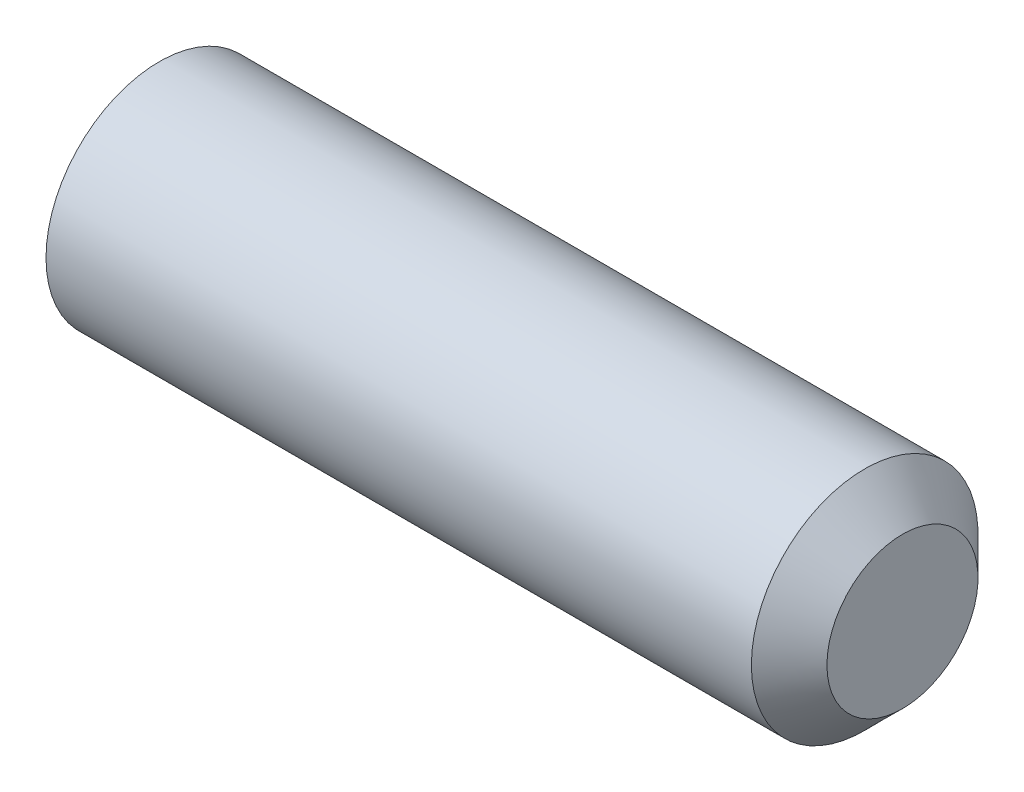
ISO-10303-21;
HEADER;
FILE_DESCRIPTION(('STEP AP214'),'2;1');
FILE_NAME('part.step','',(''),(''),'','','');
FILE_SCHEMA(('AUTOMOTIVE_DESIGN { 1 0 10303 214 1 1 1 1 }'));
ENDSEC;
DATA;
#1=APPLICATION_CONTEXT('core data for automotive mechanical design processes');
#2=APPLICATION_PROTOCOL_DEFINITION('international standard','automotive_design',2000,#1);
#3=PRODUCT_CONTEXT('',#1,'mechanical');
#4=PRODUCT('Part','Part','',(#3));
#5=PRODUCT_RELATED_PRODUCT_CATEGORY('part','',(#4));
#6=PRODUCT_DEFINITION_FORMATION('','',#4);
#7=PRODUCT_DEFINITION_CONTEXT('part definition',#1,'design');
#8=PRODUCT_DEFINITION('design','',#6,#7);
#9=PRODUCT_DEFINITION_SHAPE('','',#8);
#10=(LENGTH_UNIT() NAMED_UNIT(*) SI_UNIT(.MILLI.,.METRE.));
#11=(NAMED_UNIT(*) PLANE_ANGLE_UNIT() SI_UNIT($,.RADIAN.));
#12=(NAMED_UNIT(*) SI_UNIT($,.STERADIAN.) SOLID_ANGLE_UNIT());
#13=UNCERTAINTY_MEASURE_WITH_UNIT(LENGTH_MEASURE(1.E-05),#10,'distance_accuracy_value','');
#14=(GEOMETRIC_REPRESENTATION_CONTEXT(3) GLOBAL_UNCERTAINTY_ASSIGNED_CONTEXT((#13)) GLOBAL_UNIT_ASSIGNED_CONTEXT((#10,
#11,#12)) REPRESENTATION_CONTEXT('',''));
#15=CARTESIAN_POINT('',(0.,0.,0.));
#16=DIRECTION('',(0.,0.,1.));
#17=DIRECTION('',(1.,0.,0.));
#18=AXIS2_PLACEMENT_3D('',#15,#16,#17);
#19=CARTESIAN_POINT('',(0.,0.,0.));
#20=DIRECTION('',(-1.,0.,0.));
#21=DIRECTION('',(0.,0.,1.));
#22=AXIS2_PLACEMENT_3D('',#19,#20,#21);
#23=PLANE('',#22);
#24=CARTESIAN_POINT('',(0.,0.,0.));
#25=DIRECTION('',(-1.,0.,0.));
#26=DIRECTION('',(0.,0.,1.));
#27=AXIS2_PLACEMENT_3D('',#24,#25,#26);
#28=CIRCLE('',#27,1.2195);
#29=CARTESIAN_POINT('',(0.,0.,1.2195));
#30=VERTEX_POINT('',#29);
#31=EDGE_CURVE('E137',#30,#30,#28,.T.);
#32=ORIENTED_EDGE('',*,*,#31,.T.);
#33=EDGE_LOOP('',(#32));
#34=FACE_BOUND('',#33,.T.);
#35=DIRECTION('',(0.,0.,-1.));
#36=VECTOR('',#35,1.);
#37=CARTESIAN_POINT('',(0.,0.750000000000003,0.433012701892217));
#38=LINE('',#37,#36);
#39=CARTESIAN_POINT('',(0.,0.750000000000003,0.433012701892217));
#40=VERTEX_POINT('',#39);
#41=CARTESIAN_POINT('',(0.,0.750000000000003,-0.433012701892222));
#42=VERTEX_POINT('',#41);
#43=EDGE_CURVE('E128',#40,#42,#38,.T.);
#44=ORIENTED_EDGE('',*,*,#43,.F.);
#45=DIRECTION('',(0.,-0.866025403784439,0.5));
#46=VECTOR('',#45,1.);
#47=CARTESIAN_POINT('',(0.,0.750000000000003,0.433012701892217));
#48=LINE('',#47,#46);
#49=CARTESIAN_POINT('',(0.,0.,0.866025403784436));
#50=VERTEX_POINT('',#49);
#51=EDGE_CURVE('E50',#40,#50,#48,.T.);
#52=ORIENTED_EDGE('',*,*,#51,.T.);
#53=DIRECTION('',(0.,0.866025403784439,0.5));
#54=VECTOR('',#53,1.);
#55=CARTESIAN_POINT('',(0.,-0.749999999999997,0.433012701892217));
#56=LINE('',#55,#54);
#57=CARTESIAN_POINT('',(0.,-0.749999999999997,0.433012701892217));
#58=VERTEX_POINT('',#57);
#59=EDGE_CURVE('E119',#58,#50,#56,.T.);
#60=ORIENTED_EDGE('',*,*,#59,.F.);
#61=DIRECTION('',(0.,0.,-1.));
#62=VECTOR('',#61,1.);
#63=CARTESIAN_POINT('',(0.,-0.749999999999997,0.433012701892217));
#64=LINE('',#63,#62);
#65=CARTESIAN_POINT('',(0.,-0.749999999999997,-0.433012701892222));
#66=VERTEX_POINT('',#65);
#67=EDGE_CURVE('E122',#58,#66,#64,.T.);
#68=ORIENTED_EDGE('',*,*,#67,.T.);
#69=DIRECTION('',(0.,0.866025403784438,-0.5));
#70=VECTOR('',#69,1.);
#71=CARTESIAN_POINT('',(0.,-0.749999999999997,-0.433012701892222));
#72=LINE('',#71,#70);
#73=CARTESIAN_POINT('',(0.,0.,-0.866025403784442));
#74=VERTEX_POINT('',#73);
#75=EDGE_CURVE('E125',#66,#74,#72,.T.);
#76=ORIENTED_EDGE('',*,*,#75,.T.);
#77=DIRECTION('',(0.,-0.866025403784439,-0.5));
#78=VECTOR('',#77,1.);
#79=CARTESIAN_POINT('',(0.,0.750000000000003,-0.433012701892222));
#80=LINE('',#79,#78);
#81=EDGE_CURVE('E108',#42,#74,#80,.T.);
#82=ORIENTED_EDGE('',*,*,#81,.F.);
#83=EDGE_LOOP('',(#44,#52,#60,#68,#76,#82));
#84=FACE_BOUND('',#83,.T.);
#85=ADVANCED_FACE('F35',(#34,#84),#23,.T.);
#86=CARTESIAN_POINT('',(10.,1.,0.));
#87=DIRECTION('',(1.,0.,0.));
#88=DIRECTION('',(0.,0.,-1.));
#89=AXIS2_PLACEMENT_3D('',#86,#87,#88);
#90=PLANE('',#89);
#91=CARTESIAN_POINT('',(10.,0.,0.));
#92=DIRECTION('',(-1.,0.,0.));
#93=DIRECTION('',(0.,0.,1.));
#94=AXIS2_PLACEMENT_3D('',#91,#92,#93);
#95=CIRCLE('',#94,1.);
#96=CARTESIAN_POINT('',(10.,0.,1.));
#97=VERTEX_POINT('',#96);
#98=EDGE_CURVE('E11',#97,#97,#95,.T.);
#99=ORIENTED_EDGE('',*,*,#98,.F.);
#100=EDGE_LOOP('',(#99));
#101=FACE_BOUND('',#100,.T.);
#102=ADVANCED_FACE('F37',(#101),#90,.T.);
#103=CARTESIAN_POINT('',(9.50000000000001,0.,0.));
#104=DIRECTION('',(-1.,0.,0.));
#105=DIRECTION('',(0.,0.,1.));
#106=AXIS2_PLACEMENT_3D('',#103,#104,#105);
#107=CONICAL_SURFACE('',#106,1.5,0.785398163397454);
#108=ORIENTED_EDGE('',*,*,#98,.T.);
#109=EDGE_LOOP('',(#108));
#110=FACE_BOUND('',#109,.T.);
#111=CARTESIAN_POINT('',(9.50000000000001,0.,0.));
#112=DIRECTION('',(-1.,0.,0.));
#113=DIRECTION('',(0.,0.,1.));
#114=AXIS2_PLACEMENT_3D('',#111,#112,#113);
#115=CIRCLE('',#114,1.5);
#116=CARTESIAN_POINT('',(9.50000000000001,0.,1.5));
#117=VERTEX_POINT('',#116);
#118=EDGE_CURVE('E43',#117,#117,#115,.T.);
#119=ORIENTED_EDGE('',*,*,#118,.F.);
#120=EDGE_LOOP('',(#119));
#121=FACE_BOUND('',#120,.T.);
#122=ADVANCED_FACE('F148',(#110,#121),#107,.T.);
#123=CARTESIAN_POINT('',(-12.7,0.,0.));
#124=DIRECTION('',(-1.,0.,0.));
#125=DIRECTION('',(0.,0.,1.));
#126=AXIS2_PLACEMENT_3D('',#123,#124,#125);
#127=CYLINDRICAL_SURFACE('',#126,1.5);
#128=ORIENTED_EDGE('',*,*,#118,.T.);
#129=EDGE_LOOP('',(#128));
#130=FACE_BOUND('',#129,.T.);
#131=CARTESIAN_POINT('',(0.161946750507689,0.,0.));
#132=DIRECTION('',(-1.,0.,0.));
#133=DIRECTION('',(0.,0.,1.));
#134=AXIS2_PLACEMENT_3D('',#131,#132,#133);
#135=CIRCLE('',#134,1.5);
#136=CARTESIAN_POINT('',(0.161946750507689,0.,1.5));
#137=VERTEX_POINT('',#136);
#138=EDGE_CURVE('E140',#137,#137,#135,.T.);
#139=ORIENTED_EDGE('',*,*,#138,.F.);
#140=EDGE_LOOP('',(#139));
#141=FACE_BOUND('',#140,.T.);
#142=ADVANCED_FACE('F145',(#130,#141),#127,.T.);
#143=CARTESIAN_POINT('',(0.,0.,0.));
#144=DIRECTION('',(1.,0.,0.));
#145=DIRECTION('',(0.,0.,-1.));
#146=AXIS2_PLACEMENT_3D('',#143,#144,#145);
#147=CONICAL_SURFACE('',#146,1.2195,1.0471975511966);
#148=ORIENTED_EDGE('',*,*,#138,.T.);
#149=EDGE_LOOP('',(#148));
#150=FACE_BOUND('',#149,.T.);
#151=ORIENTED_EDGE('',*,*,#31,.F.);
#152=EDGE_LOOP('',(#151));
#153=FACE_BOUND('',#152,.T.);
#154=ADVANCED_FACE('F155',(#150,#153),#147,.T.);
#155=CARTESIAN_POINT('',(2.1,0.750000000000003,0.433012701892217));
#156=DIRECTION('',(0.,-0.5,-0.866025403784439));
#157=DIRECTION('',(0.,0.866025403784439,-0.5));
#158=AXIS2_PLACEMENT_3D('',#155,#156,#157);
#159=PLANE('',#158);
#160=ORIENTED_EDGE('',*,*,#51,.F.);
#161=DIRECTION('',(-1.,0.,0.));
#162=VECTOR('',#161,1.);
#163=CARTESIAN_POINT('',(2.1,0.750000000000003,0.433012701892217));
#164=LINE('',#163,#162);
#165=CARTESIAN_POINT('',(2.1,0.750000000000003,0.433012701892217));
#166=VERTEX_POINT('',#165);
#167=EDGE_CURVE('E55',#166,#40,#164,.T.);
#168=ORIENTED_EDGE('',*,*,#167,.F.);
#169=DIRECTION('',(0.,-0.866025403784439,0.5));
#170=VECTOR('',#169,1.);
#171=CARTESIAN_POINT('',(2.1,0.750000000000003,0.433012701892217));
#172=LINE('',#171,#170);
#173=CARTESIAN_POINT('',(2.1,0.,0.866025403784436));
#174=VERTEX_POINT('',#173);
#175=EDGE_CURVE('E82',#166,#174,#172,.T.);
#176=ORIENTED_EDGE('',*,*,#175,.T.);
#177=DIRECTION('',(-1.,0.,0.));
#178=VECTOR('',#177,1.);
#179=CARTESIAN_POINT('',(2.1,0.,0.866025403784436));
#180=LINE('',#179,#178);
#181=EDGE_CURVE('E135',#174,#50,#180,.T.);
#182=ORIENTED_EDGE('',*,*,#181,.T.);
#183=EDGE_LOOP('',(#160,#168,#176,#182));
#184=FACE_BOUND('',#183,.T.);
#185=ADVANCED_FACE('F166',(#184),#159,.T.);
#186=CARTESIAN_POINT('',(2.1,-0.749999999999997,0.433012701892217));
#187=DIRECTION('',(0.,-0.5,0.866025403784439));
#188=DIRECTION('',(0.,-0.866025403784439,-0.5));
#189=AXIS2_PLACEMENT_3D('',#186,#187,#188);
#190=PLANE('',#189);
#191=ORIENTED_EDGE('',*,*,#59,.T.);
#192=ORIENTED_EDGE('',*,*,#181,.F.);
#193=DIRECTION('',(0.,0.866025403784439,0.5));
#194=VECTOR('',#193,1.);
#195=CARTESIAN_POINT('',(2.1,-0.749999999999997,0.433012701892217));
#196=LINE('',#195,#194);
#197=CARTESIAN_POINT('',(2.1,-0.749999999999997,0.433012701892217));
#198=VERTEX_POINT('',#197);
#199=EDGE_CURVE('E268',#198,#174,#196,.T.);
#200=ORIENTED_EDGE('',*,*,#199,.F.);
#201=DIRECTION('',(-1.,0.,0.));
#202=VECTOR('',#201,1.);
#203=CARTESIAN_POINT('',(2.1,-0.749999999999997,0.433012701892217));
#204=LINE('',#203,#202);
#205=EDGE_CURVE('E133',#198,#58,#204,.T.);
#206=ORIENTED_EDGE('',*,*,#205,.T.);
#207=EDGE_LOOP('',(#191,#192,#200,#206));
#208=FACE_BOUND('',#207,.T.);
#209=ADVANCED_FACE('F173',(#208),#190,.F.);
#210=CARTESIAN_POINT('',(2.1,-0.749999999999997,0.433012701892217));
#211=DIRECTION('',(0.,1.,0.));
#212=DIRECTION('',(0.,0.,1.));
#213=AXIS2_PLACEMENT_3D('',#210,#211,#212);
#214=PLANE('',#213);
#215=ORIENTED_EDGE('',*,*,#67,.F.);
#216=ORIENTED_EDGE('',*,*,#205,.F.);
#217=DIRECTION('',(0.,0.,-1.));
#218=VECTOR('',#217,1.);
#219=CARTESIAN_POINT('',(2.1,-0.749999999999997,0.433012701892217));
#220=LINE('',#219,#218);
#221=CARTESIAN_POINT('',(2.1,-0.749999999999997,-0.433012701892222));
#222=VERTEX_POINT('',#221);
#223=EDGE_CURVE('E103',#198,#222,#220,.T.);
#224=ORIENTED_EDGE('',*,*,#223,.T.);
#225=DIRECTION('',(-1.,0.,0.));
#226=VECTOR('',#225,1.);
#227=CARTESIAN_POINT('',(2.1,-0.749999999999997,-0.433012701892222));
#228=LINE('',#227,#226);
#229=EDGE_CURVE('E98',#222,#66,#228,.T.);
#230=ORIENTED_EDGE('',*,*,#229,.T.);
#231=EDGE_LOOP('',(#215,#216,#224,#230));
#232=FACE_BOUND('',#231,.T.);
#233=ADVANCED_FACE('F180',(#232),#214,.T.);
#234=CARTESIAN_POINT('',(2.1,-0.749999999999997,-0.433012701892222));
#235=DIRECTION('',(0.,0.5,0.866025403784438));
#236=DIRECTION('',(0.,-0.866025403784439,0.5));
#237=AXIS2_PLACEMENT_3D('',#234,#235,#236);
#238=PLANE('',#237);
#239=ORIENTED_EDGE('',*,*,#75,.F.);
#240=ORIENTED_EDGE('',*,*,#229,.F.);
#241=DIRECTION('',(0.,0.866025403784438,-0.5));
#242=VECTOR('',#241,1.);
#243=CARTESIAN_POINT('',(2.1,-0.749999999999997,-0.433012701892222));
#244=LINE('',#243,#242);
#245=CARTESIAN_POINT('',(2.1,0.,-0.866025403784442));
#246=VERTEX_POINT('',#245);
#247=EDGE_CURVE('E93',#222,#246,#244,.T.);
#248=ORIENTED_EDGE('',*,*,#247,.T.);
#249=DIRECTION('',(-1.,0.,0.));
#250=VECTOR('',#249,1.);
#251=CARTESIAN_POINT('',(2.1,0.,-0.866025403784442));
#252=LINE('',#251,#250);
#253=EDGE_CURVE('E97',#246,#74,#252,.T.);
#254=ORIENTED_EDGE('',*,*,#253,.T.);
#255=EDGE_LOOP('',(#239,#240,#248,#254));
#256=FACE_BOUND('',#255,.T.);
#257=ADVANCED_FACE('F96',(#256),#238,.T.);
#258=CARTESIAN_POINT('',(2.1,0.750000000000003,-0.433012701892222));
#259=DIRECTION('',(0.,0.5,-0.866025403784439));
#260=DIRECTION('',(0.,0.866025403784439,0.5));
#261=AXIS2_PLACEMENT_3D('',#258,#259,#260);
#262=PLANE('',#261);
#263=ORIENTED_EDGE('',*,*,#81,.T.);
#264=ORIENTED_EDGE('',*,*,#253,.F.);
#265=DIRECTION('',(0.,-0.866025403784439,-0.5));
#266=VECTOR('',#265,1.);
#267=CARTESIAN_POINT('',(2.1,0.750000000000003,-0.433012701892222));
#268=LINE('',#267,#266);
#269=CARTESIAN_POINT('',(2.1,0.750000000000003,-0.433012701892222));
#270=VERTEX_POINT('',#269);
#271=EDGE_CURVE('E102',#270,#246,#268,.T.);
#272=ORIENTED_EDGE('',*,*,#271,.F.);
#273=DIRECTION('',(-1.,0.,0.));
#274=VECTOR('',#273,1.);
#275=CARTESIAN_POINT('',(2.1,0.750000000000003,-0.433012701892222));
#276=LINE('',#275,#274);
#277=EDGE_CURVE('E78',#270,#42,#276,.T.);
#278=ORIENTED_EDGE('',*,*,#277,.T.);
#279=EDGE_LOOP('',(#263,#264,#272,#278));
#280=FACE_BOUND('',#279,.T.);
#281=ADVANCED_FACE('F105',(#280),#262,.F.);
#282=CARTESIAN_POINT('',(2.1,0.750000000000003,0.433012701892217));
#283=DIRECTION('',(0.,1.,0.));
#284=DIRECTION('',(0.,0.,1.));
#285=AXIS2_PLACEMENT_3D('',#282,#283,#284);
#286=PLANE('',#285);
#287=ORIENTED_EDGE('',*,*,#43,.T.);
#288=ORIENTED_EDGE('',*,*,#277,.F.);
#289=DIRECTION('',(0.,0.,-1.));
#290=VECTOR('',#289,1.);
#291=CARTESIAN_POINT('',(2.1,0.750000000000003,0.433012701892217));
#292=LINE('',#291,#290);
#293=EDGE_CURVE('E113',#166,#270,#292,.T.);
#294=ORIENTED_EDGE('',*,*,#293,.F.);
#295=ORIENTED_EDGE('',*,*,#167,.T.);
#296=EDGE_LOOP('',(#287,#288,#294,#295));
#297=FACE_BOUND('',#296,.T.);
#298=ADVANCED_FACE('F192',(#297),#286,.F.);
#299=CARTESIAN_POINT('',(2.1,-0.749999999999997,1.29903810567666));
#300=DIRECTION('',(1.,0.,0.));
#301=DIRECTION('',(0.,0.,-1.));
#302=AXIS2_PLACEMENT_3D('',#299,#300,#301);
#303=PLANE('',#302);
#304=ORIENTED_EDGE('',*,*,#175,.F.);
#305=ORIENTED_EDGE('',*,*,#293,.T.);
#306=ORIENTED_EDGE('',*,*,#271,.T.);
#307=ORIENTED_EDGE('',*,*,#247,.F.);
#308=ORIENTED_EDGE('',*,*,#223,.F.);
#309=ORIENTED_EDGE('',*,*,#199,.T.);
#310=EDGE_LOOP('',(#304,#305,#306,#307,#308,#309));
#311=FACE_BOUND('',#310,.T.);
#312=ADVANCED_FACE('F111',(#311),#303,.F.);
#313=CLOSED_SHELL('',(#85,#102,#122,#142,#154,#185,#209,#233,#257,#281,#298,#312));
#314=MANIFOLD_SOLID_BREP('B2',#313);
#315=ADVANCED_BREP_SHAPE_REPRESENTATION('',(#18,#314),#14);
#316=SHAPE_DEFINITION_REPRESENTATION(#9,#315);
ENDSEC;
END-ISO-10303-21;
